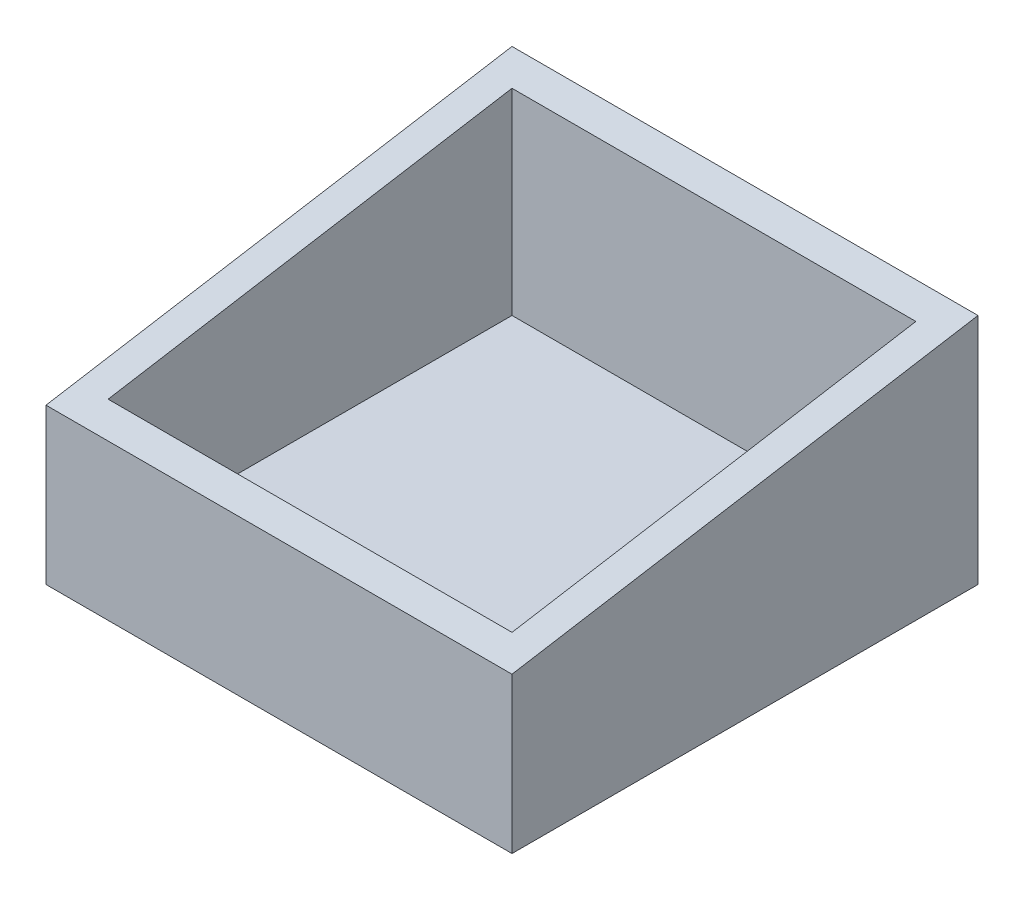
ISO-10303-21;
HEADER;
FILE_DESCRIPTION(('STEP AP214'),'2;1');
FILE_NAME('part.step','',(''),(''),'','','');
FILE_SCHEMA(('AUTOMOTIVE_DESIGN { 1 0 10303 214 1 1 1 1 }'));
ENDSEC;
DATA;
#1=APPLICATION_CONTEXT('core data for automotive mechanical design processes');
#2=APPLICATION_PROTOCOL_DEFINITION('international standard','automotive_design',2000,#1);
#3=PRODUCT_CONTEXT('',#1,'mechanical');
#4=PRODUCT('Part','Part','',(#3));
#5=PRODUCT_RELATED_PRODUCT_CATEGORY('part','',(#4));
#6=PRODUCT_DEFINITION_FORMATION('','',#4);
#7=PRODUCT_DEFINITION_CONTEXT('part definition',#1,'design');
#8=PRODUCT_DEFINITION('design','',#6,#7);
#9=PRODUCT_DEFINITION_SHAPE('','',#8);
#10=(LENGTH_UNIT() NAMED_UNIT(*) SI_UNIT(.MILLI.,.METRE.));
#11=(NAMED_UNIT(*) PLANE_ANGLE_UNIT() SI_UNIT($,.RADIAN.));
#12=(NAMED_UNIT(*) SI_UNIT($,.STERADIAN.) SOLID_ANGLE_UNIT());
#13=UNCERTAINTY_MEASURE_WITH_UNIT(LENGTH_MEASURE(1.E-05),#10,'distance_accuracy_value','');
#14=(GEOMETRIC_REPRESENTATION_CONTEXT(3) GLOBAL_UNCERTAINTY_ASSIGNED_CONTEXT((#13)) GLOBAL_UNIT_ASSIGNED_CONTEXT((#10,
#11,#12)) REPRESENTATION_CONTEXT('',''));
#15=CARTESIAN_POINT('',(0.,0.,0.));
#16=DIRECTION('',(0.,0.,1.));
#17=DIRECTION('',(1.,0.,0.));
#18=AXIS2_PLACEMENT_3D('',#15,#16,#17);
#19=CARTESIAN_POINT('',(0.,150.,0.));
#20=DIRECTION('',(0.,0.986393923832144,0.164398987305357));
#21=DIRECTION('',(0.,-0.164398987305357,0.986393923832144));
#22=AXIS2_PLACEMENT_3D('',#19,#20,#21);
#23=PLANE('',#22);
#24=DIRECTION('',(0.,-0.164398987305357,0.986393923832144));
#25=VECTOR('',#24,1.);
#26=CARTESIAN_POINT('',(300.,150.,0.));
#27=LINE('',#26,#25);
#28=CARTESIAN_POINT('',(300.,150.,0.));
#29=VERTEX_POINT('',#28);
#30=CARTESIAN_POINT('',(300.,100.,300.));
#31=VERTEX_POINT('',#30);
#32=EDGE_CURVE('E73',#29,#31,#27,.T.);
#33=ORIENTED_EDGE('',*,*,#32,.F.);
#34=DIRECTION('',(-1.,0.,0.));
#35=VECTOR('',#34,1.);
#36=CARTESIAN_POINT('',(300.,150.,0.));
#37=LINE('',#36,#35);
#38=CARTESIAN_POINT('',(0.,150.,0.));
#39=VERTEX_POINT('',#38);
#40=EDGE_CURVE('E79',#29,#39,#37,.T.);
#41=ORIENTED_EDGE('',*,*,#40,.T.);
#42=DIRECTION('',(0.,-0.164398987305357,0.986393923832144));
#43=VECTOR('',#42,1.);
#44=CARTESIAN_POINT('',(0.,150.,0.));
#45=LINE('',#44,#43);
#46=CARTESIAN_POINT('',(0.,100.,300.));
#47=VERTEX_POINT('',#46);
#48=EDGE_CURVE('E86',#39,#47,#45,.T.);
#49=ORIENTED_EDGE('',*,*,#48,.T.);
#50=DIRECTION('',(1.,0.,0.));
#51=VECTOR('',#50,1.);
#52=CARTESIAN_POINT('',(0.,100.,300.));
#53=LINE('',#52,#51);
#54=EDGE_CURVE('E83',#47,#31,#53,.T.);
#55=ORIENTED_EDGE('',*,*,#54,.T.);
#56=EDGE_LOOP('',(#33,#41,#49,#55));
#57=FACE_BOUND('',#56,.T.);
#58=DIRECTION('',(-1.,0.,0.));
#59=VECTOR('',#58,1.);
#60=CARTESIAN_POINT('',(0.,146.666666666667,20.));
#61=LINE('',#60,#59);
#62=CARTESIAN_POINT('',(280.,146.666666666667,20.));
#63=VERTEX_POINT('',#62);
#64=CARTESIAN_POINT('',(20.,146.666666666667,20.));
#65=VERTEX_POINT('',#64);
#66=EDGE_CURVE('E117',#63,#65,#61,.T.);
#67=ORIENTED_EDGE('',*,*,#66,.F.);
#68=DIRECTION('',(0.,-0.164398987305357,0.986393923832144));
#69=VECTOR('',#68,1.);
#70=CARTESIAN_POINT('',(280.,150.,0.));
#71=LINE('',#70,#69);
#72=CARTESIAN_POINT('',(280.,103.333333333333,280.));
#73=VERTEX_POINT('',#72);
#74=EDGE_CURVE('E121',#63,#73,#71,.T.);
#75=ORIENTED_EDGE('',*,*,#74,.T.);
#76=DIRECTION('',(1.,0.,0.));
#77=VECTOR('',#76,1.);
#78=CARTESIAN_POINT('',(0.,103.333333333333,280.));
#79=LINE('',#78,#77);
#80=CARTESIAN_POINT('',(20.,103.333333333333,280.));
#81=VERTEX_POINT('',#80);
#82=EDGE_CURVE('E125',#81,#73,#79,.T.);
#83=ORIENTED_EDGE('',*,*,#82,.F.);
#84=DIRECTION('',(0.,-0.164398987305357,0.986393923832144));
#85=VECTOR('',#84,1.);
#86=CARTESIAN_POINT('',(20.,101.351351351351,291.891891891892));
#87=LINE('',#86,#85);
#88=EDGE_CURVE('E124',#65,#81,#87,.T.);
#89=ORIENTED_EDGE('',*,*,#88,.F.);
#90=EDGE_LOOP('',(#67,#75,#83,#89));
#91=FACE_BOUND('',#90,.T.);
#92=ADVANCED_FACE('F32',(#57,#91),#23,.T.);
#93=CARTESIAN_POINT('',(0.,150.,300.));
#94=DIRECTION('',(1.,0.,0.));
#95=DIRECTION('',(0.,1.,0.));
#96=AXIS2_PLACEMENT_3D('',#93,#94,#95);
#97=PLANE('',#96);
#98=ORIENTED_EDGE('',*,*,#48,.F.);
#99=DIRECTION('',(0.,-1.,0.));
#100=VECTOR('',#99,1.);
#101=CARTESIAN_POINT('',(0.,150.,0.));
#102=LINE('',#101,#100);
#103=CARTESIAN_POINT('',(0.,0.,0.));
#104=VERTEX_POINT('',#103);
#105=EDGE_CURVE('E99',#39,#104,#102,.T.);
#106=ORIENTED_EDGE('',*,*,#105,.T.);
#107=DIRECTION('',(0.,0.,-1.));
#108=VECTOR('',#107,1.);
#109=CARTESIAN_POINT('',(0.,0.,300.));
#110=LINE('',#109,#108);
#111=CARTESIAN_POINT('',(0.,0.,300.));
#112=VERTEX_POINT('',#111);
#113=EDGE_CURVE('E11',#112,#104,#110,.T.);
#114=ORIENTED_EDGE('',*,*,#113,.F.);
#115=DIRECTION('',(0.,-1.,0.));
#116=VECTOR('',#115,1.);
#117=CARTESIAN_POINT('',(0.,150.,300.));
#118=LINE('',#117,#116);
#119=EDGE_CURVE('E100',#47,#112,#118,.T.);
#120=ORIENTED_EDGE('',*,*,#119,.F.);
#121=EDGE_LOOP('',(#98,#106,#114,#120));
#122=FACE_BOUND('',#121,.T.);
#123=ADVANCED_FACE('F34',(#122),#97,.F.);
#124=CARTESIAN_POINT('',(300.,0.,300.));
#125=DIRECTION('',(-1.,0.,0.));
#126=DIRECTION('',(0.,0.,1.));
#127=AXIS2_PLACEMENT_3D('',#124,#125,#126);
#128=PLANE('',#127);
#129=ORIENTED_EDGE('',*,*,#32,.T.);
#130=DIRECTION('',(0.,1.,0.));
#131=VECTOR('',#130,1.);
#132=CARTESIAN_POINT('',(300.,0.,300.));
#133=LINE('',#132,#131);
#134=CARTESIAN_POINT('',(300.,0.,300.));
#135=VERTEX_POINT('',#134);
#136=EDGE_CURVE('E104',#135,#31,#133,.T.);
#137=ORIENTED_EDGE('',*,*,#136,.F.);
#138=DIRECTION('',(0.,0.,-1.));
#139=VECTOR('',#138,1.);
#140=CARTESIAN_POINT('',(300.,0.,300.));
#141=LINE('',#140,#139);
#142=CARTESIAN_POINT('',(300.,0.,0.));
#143=VERTEX_POINT('',#142);
#144=EDGE_CURVE('E40',#135,#143,#141,.T.);
#145=ORIENTED_EDGE('',*,*,#144,.T.);
#146=DIRECTION('',(0.,1.,0.));
#147=VECTOR('',#146,1.);
#148=CARTESIAN_POINT('',(300.,0.,0.));
#149=LINE('',#148,#147);
#150=EDGE_CURVE('E91',#143,#29,#149,.T.);
#151=ORIENTED_EDGE('',*,*,#150,.T.);
#152=EDGE_LOOP('',(#129,#137,#145,#151));
#153=FACE_BOUND('',#152,.T.);
#154=ADVANCED_FACE('F92',(#153),#128,.F.);
#155=CARTESIAN_POINT('',(0.,0.,300.));
#156=DIRECTION('',(0.,0.,1.));
#157=DIRECTION('',(1.,0.,0.));
#158=AXIS2_PLACEMENT_3D('',#155,#156,#157);
#159=PLANE('',#158);
#160=ORIENTED_EDGE('',*,*,#136,.T.);
#161=ORIENTED_EDGE('',*,*,#54,.F.);
#162=ORIENTED_EDGE('',*,*,#119,.T.);
#163=DIRECTION('',(1.,0.,0.));
#164=VECTOR('',#163,1.);
#165=CARTESIAN_POINT('',(0.,0.,300.));
#166=LINE('',#165,#164);
#167=EDGE_CURVE('E56',#112,#135,#166,.T.);
#168=ORIENTED_EDGE('',*,*,#167,.T.);
#169=EDGE_LOOP('',(#160,#161,#162,#168));
#170=FACE_BOUND('',#169,.T.);
#171=ADVANCED_FACE('F195',(#170),#159,.T.);
#172=CARTESIAN_POINT('',(0.,0.,300.));
#173=DIRECTION('',(0.,1.,0.));
#174=DIRECTION('',(0.,0.,1.));
#175=AXIS2_PLACEMENT_3D('',#172,#173,#174);
#176=PLANE('',#175);
#177=DIRECTION('',(1.,0.,0.));
#178=VECTOR('',#177,1.);
#179=CARTESIAN_POINT('',(0.,0.,0.));
#180=LINE('',#179,#178);
#181=EDGE_CURVE('E94',#104,#143,#180,.T.);
#182=ORIENTED_EDGE('',*,*,#181,.T.);
#183=ORIENTED_EDGE('',*,*,#144,.F.);
#184=ORIENTED_EDGE('',*,*,#167,.F.);
#185=ORIENTED_EDGE('',*,*,#113,.T.);
#186=EDGE_LOOP('',(#182,#183,#184,#185));
#187=FACE_BOUND('',#186,.T.);
#188=ADVANCED_FACE('F109',(#187),#176,.F.);
#189=CARTESIAN_POINT('',(0.,0.,0.));
#190=DIRECTION('',(0.,0.,1.));
#191=DIRECTION('',(1.,0.,0.));
#192=AXIS2_PLACEMENT_3D('',#189,#190,#191);
#193=PLANE('',#192);
#194=ORIENTED_EDGE('',*,*,#105,.F.);
#195=ORIENTED_EDGE('',*,*,#40,.F.);
#196=ORIENTED_EDGE('',*,*,#150,.F.);
#197=ORIENTED_EDGE('',*,*,#181,.F.);
#198=EDGE_LOOP('',(#194,#195,#196,#197));
#199=FACE_BOUND('',#198,.T.);
#200=ADVANCED_FACE('F97',(#199),#193,.F.);
#201=CARTESIAN_POINT('',(20.,150.,300.));
#202=DIRECTION('',(1.,0.,0.));
#203=DIRECTION('',(0.,1.,0.));
#204=AXIS2_PLACEMENT_3D('',#201,#202,#203);
#205=PLANE('',#204);
#206=ORIENTED_EDGE('',*,*,#88,.T.);
#207=DIRECTION('',(0.,-1.,0.));
#208=VECTOR('',#207,1.);
#209=CARTESIAN_POINT('',(20.,150.,280.));
#210=LINE('',#209,#208);
#211=CARTESIAN_POINT('',(20.,20.,280.));
#212=VERTEX_POINT('',#211);
#213=EDGE_CURVE('E47',#81,#212,#210,.T.);
#214=ORIENTED_EDGE('',*,*,#213,.T.);
#215=DIRECTION('',(0.,0.,-1.));
#216=VECTOR('',#215,1.);
#217=CARTESIAN_POINT('',(20.,20.,300.));
#218=LINE('',#217,#216);
#219=CARTESIAN_POINT('',(20.,20.,20.));
#220=VERTEX_POINT('',#219);
#221=EDGE_CURVE('E87',#212,#220,#218,.T.);
#222=ORIENTED_EDGE('',*,*,#221,.T.);
#223=DIRECTION('',(0.,-1.,0.));
#224=VECTOR('',#223,1.);
#225=CARTESIAN_POINT('',(20.,150.,20.));
#226=LINE('',#225,#224);
#227=EDGE_CURVE('E127',#65,#220,#226,.T.);
#228=ORIENTED_EDGE('',*,*,#227,.F.);
#229=EDGE_LOOP('',(#206,#214,#222,#228));
#230=FACE_BOUND('',#229,.T.);
#231=ADVANCED_FACE('F158',(#230),#205,.T.);
#232=CARTESIAN_POINT('',(280.,0.,300.));
#233=DIRECTION('',(-1.,0.,0.));
#234=DIRECTION('',(0.,0.,1.));
#235=AXIS2_PLACEMENT_3D('',#232,#233,#234);
#236=PLANE('',#235);
#237=ORIENTED_EDGE('',*,*,#74,.F.);
#238=DIRECTION('',(0.,1.,0.));
#239=VECTOR('',#238,1.);
#240=CARTESIAN_POINT('',(280.,0.,20.));
#241=LINE('',#240,#239);
#242=CARTESIAN_POINT('',(280.,20.,20.));
#243=VERTEX_POINT('',#242);
#244=EDGE_CURVE('E120',#243,#63,#241,.T.);
#245=ORIENTED_EDGE('',*,*,#244,.F.);
#246=DIRECTION('',(0.,0.,-1.));
#247=VECTOR('',#246,1.);
#248=CARTESIAN_POINT('',(280.,20.,300.));
#249=LINE('',#248,#247);
#250=CARTESIAN_POINT('',(280.,20.,280.));
#251=VERTEX_POINT('',#250);
#252=EDGE_CURVE('E134',#251,#243,#249,.T.);
#253=ORIENTED_EDGE('',*,*,#252,.F.);
#254=DIRECTION('',(0.,1.,0.));
#255=VECTOR('',#254,1.);
#256=CARTESIAN_POINT('',(280.,0.,280.));
#257=LINE('',#256,#255);
#258=EDGE_CURVE('E137',#251,#73,#257,.T.);
#259=ORIENTED_EDGE('',*,*,#258,.T.);
#260=EDGE_LOOP('',(#237,#245,#253,#259));
#261=FACE_BOUND('',#260,.T.);
#262=ADVANCED_FACE('F171',(#261),#236,.T.);
#263=CARTESIAN_POINT('',(0.,0.,280.));
#264=DIRECTION('',(0.,0.,1.));
#265=DIRECTION('',(1.,0.,0.));
#266=AXIS2_PLACEMENT_3D('',#263,#264,#265);
#267=PLANE('',#266);
#268=ORIENTED_EDGE('',*,*,#258,.F.);
#269=DIRECTION('',(1.,0.,0.));
#270=VECTOR('',#269,1.);
#271=CARTESIAN_POINT('',(0.,20.,280.));
#272=LINE('',#271,#270);
#273=EDGE_CURVE('E138',#212,#251,#272,.T.);
#274=ORIENTED_EDGE('',*,*,#273,.F.);
#275=ORIENTED_EDGE('',*,*,#213,.F.);
#276=ORIENTED_EDGE('',*,*,#82,.T.);
#277=EDGE_LOOP('',(#268,#274,#275,#276));
#278=FACE_BOUND('',#277,.T.);
#279=ADVANCED_FACE('F166',(#278),#267,.F.);
#280=CARTESIAN_POINT('',(0.,20.,300.));
#281=DIRECTION('',(0.,1.,0.));
#282=DIRECTION('',(0.,0.,1.));
#283=AXIS2_PLACEMENT_3D('',#280,#281,#282);
#284=PLANE('',#283);
#285=DIRECTION('',(1.,0.,0.));
#286=VECTOR('',#285,1.);
#287=CARTESIAN_POINT('',(0.,20.,20.));
#288=LINE('',#287,#286);
#289=EDGE_CURVE('E129',#220,#243,#288,.T.);
#290=ORIENTED_EDGE('',*,*,#289,.F.);
#291=ORIENTED_EDGE('',*,*,#221,.F.);
#292=ORIENTED_EDGE('',*,*,#273,.T.);
#293=ORIENTED_EDGE('',*,*,#252,.T.);
#294=EDGE_LOOP('',(#290,#291,#292,#293));
#295=FACE_BOUND('',#294,.T.);
#296=ADVANCED_FACE('F176',(#295),#284,.T.);
#297=CARTESIAN_POINT('',(0.,0.,20.));
#298=DIRECTION('',(0.,0.,1.));
#299=DIRECTION('',(1.,0.,0.));
#300=AXIS2_PLACEMENT_3D('',#297,#298,#299);
#301=PLANE('',#300);
#302=ORIENTED_EDGE('',*,*,#227,.T.);
#303=ORIENTED_EDGE('',*,*,#289,.T.);
#304=ORIENTED_EDGE('',*,*,#244,.T.);
#305=ORIENTED_EDGE('',*,*,#66,.T.);
#306=EDGE_LOOP('',(#302,#303,#304,#305));
#307=FACE_BOUND('',#306,.T.);
#308=ADVANCED_FACE('F150',(#307),#301,.T.);
#309=CLOSED_SHELL('',(#92,#123,#154,#171,#188,#200,#231,#262,#279,#296,#308));
#310=MANIFOLD_SOLID_BREP('B2',#309);
#311=ADVANCED_BREP_SHAPE_REPRESENTATION('',(#18,#310),#14);
#312=SHAPE_DEFINITION_REPRESENTATION(#9,#311);
ENDSEC;
END-ISO-10303-21;
